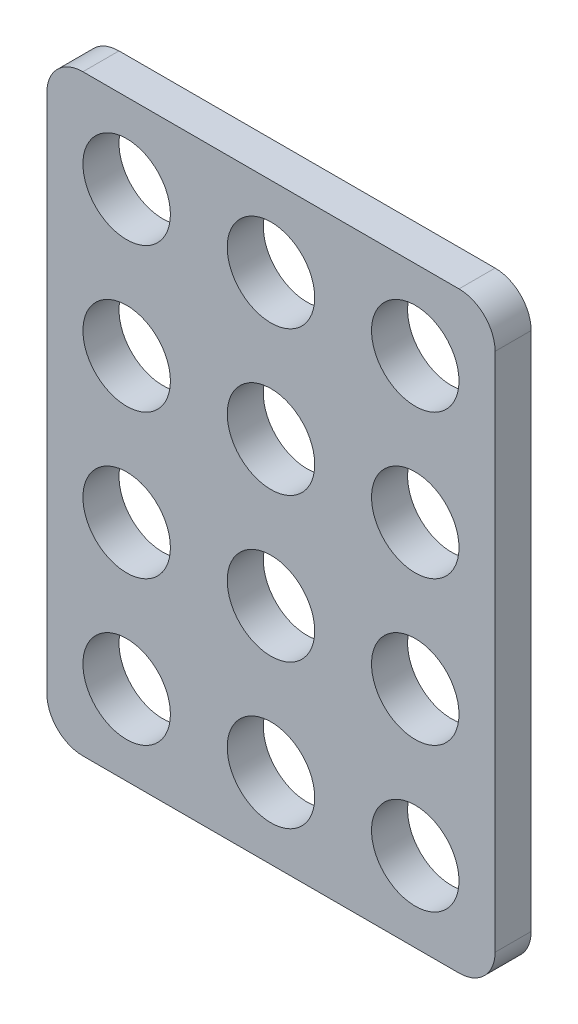
ISO-10303-21;
HEADER;
FILE_DESCRIPTION(('STEP AP214'),'2;1');
FILE_NAME('part.step','',(''),(''),'','','');
FILE_SCHEMA(('AUTOMOTIVE_DESIGN { 1 0 10303 214 1 1 1 1 }'));
ENDSEC;
DATA;
#1=APPLICATION_CONTEXT('core data for automotive mechanical design processes');
#2=APPLICATION_PROTOCOL_DEFINITION('international standard','automotive_design',2000,#1);
#3=PRODUCT_CONTEXT('',#1,'mechanical');
#4=PRODUCT('Part','Part','',(#3));
#5=PRODUCT_RELATED_PRODUCT_CATEGORY('part','',(#4));
#6=PRODUCT_DEFINITION_FORMATION('','',#4);
#7=PRODUCT_DEFINITION_CONTEXT('part definition',#1,'design');
#8=PRODUCT_DEFINITION('design','',#6,#7);
#9=PRODUCT_DEFINITION_SHAPE('','',#8);
#10=(LENGTH_UNIT() NAMED_UNIT(*) SI_UNIT(.MILLI.,.METRE.));
#11=(NAMED_UNIT(*) PLANE_ANGLE_UNIT() SI_UNIT($,.RADIAN.));
#12=(NAMED_UNIT(*) SI_UNIT($,.STERADIAN.) SOLID_ANGLE_UNIT());
#13=UNCERTAINTY_MEASURE_WITH_UNIT(LENGTH_MEASURE(1.E-05),#10,'distance_accuracy_value','');
#14=(GEOMETRIC_REPRESENTATION_CONTEXT(3) GLOBAL_UNCERTAINTY_ASSIGNED_CONTEXT((#13)) GLOBAL_UNIT_ASSIGNED_CONTEXT((#10,
#11,#12)) REPRESENTATION_CONTEXT('',''));
#15=CARTESIAN_POINT('',(0.,0.,0.));
#16=DIRECTION('',(0.,0.,1.));
#17=DIRECTION('',(1.,0.,0.));
#18=AXIS2_PLACEMENT_3D('',#15,#16,#17);
#19=CARTESIAN_POINT('',(22.85,2.,2.));
#20=DIRECTION('',(0.,0.,-1.));
#21=DIRECTION('',(-1.,0.,0.));
#22=AXIS2_PLACEMENT_3D('',#19,#20,#21);
#23=CYLINDRICAL_SURFACE('',#22,2.);
#24=CARTESIAN_POINT('',(22.85,2.,0.));
#25=DIRECTION('',(0.,0.,1.));
#26=DIRECTION('',(1.,0.,0.));
#27=AXIS2_PLACEMENT_3D('',#24,#25,#26);
#28=CIRCLE('',#27,2.);
#29=CARTESIAN_POINT('',(22.85,0.,0.));
#30=VERTEX_POINT('',#29);
#31=CARTESIAN_POINT('',(24.85,2.00000000000001,0.));
#32=VERTEX_POINT('',#31);
#33=EDGE_CURVE('E129',#30,#32,#28,.T.);
#34=ORIENTED_EDGE('',*,*,#33,.T.);
#35=DIRECTION('',(0.,0.,-1.));
#36=VECTOR('',#35,1.);
#37=CARTESIAN_POINT('',(24.85,2.00000000000001,2.));
#38=LINE('',#37,#36);
#39=CARTESIAN_POINT('',(24.85,2.00000000000001,2.));
#40=VERTEX_POINT('',#39);
#41=EDGE_CURVE('E11',#40,#32,#38,.T.);
#42=ORIENTED_EDGE('',*,*,#41,.F.);
#43=CARTESIAN_POINT('',(22.85,2.,2.));
#44=DIRECTION('',(0.,0.,1.));
#45=DIRECTION('',(1.,0.,0.));
#46=AXIS2_PLACEMENT_3D('',#43,#44,#45);
#47=CIRCLE('',#46,2.);
#48=CARTESIAN_POINT('',(22.85,0.,2.));
#49=VERTEX_POINT('',#48);
#50=EDGE_CURVE('E144',#49,#40,#47,.T.);
#51=ORIENTED_EDGE('',*,*,#50,.F.);
#52=DIRECTION('',(0.,0.,-1.));
#53=VECTOR('',#52,1.);
#54=CARTESIAN_POINT('',(22.85,0.,2.));
#55=LINE('',#54,#53);
#56=EDGE_CURVE('E125',#49,#30,#55,.T.);
#57=ORIENTED_EDGE('',*,*,#56,.T.);
#58=EDGE_LOOP('',(#34,#42,#51,#57));
#59=FACE_BOUND('',#58,.T.);
#60=ADVANCED_FACE('F33',(#59),#23,.T.);
#61=CARTESIAN_POINT('',(24.85,2.00000000000001,2.));
#62=DIRECTION('',(-1.,0.,0.));
#63=DIRECTION('',(0.,0.,1.));
#64=AXIS2_PLACEMENT_3D('',#61,#62,#63);
#65=PLANE('',#64);
#66=DIRECTION('',(0.,1.,0.));
#67=VECTOR('',#66,1.);
#68=CARTESIAN_POINT('',(24.85,2.00000000000001,0.));
#69=LINE('',#68,#67);
#70=CARTESIAN_POINT('',(24.85,30.85,0.));
#71=VERTEX_POINT('',#70);
#72=EDGE_CURVE('E132',#32,#71,#69,.T.);
#73=ORIENTED_EDGE('',*,*,#72,.T.);
#74=DIRECTION('',(0.,0.,-1.));
#75=VECTOR('',#74,1.);
#76=CARTESIAN_POINT('',(24.85,30.85,2.));
#77=LINE('',#76,#75);
#78=CARTESIAN_POINT('',(24.85,30.85,2.));
#79=VERTEX_POINT('',#78);
#80=EDGE_CURVE('E41',#79,#71,#77,.T.);
#81=ORIENTED_EDGE('',*,*,#80,.F.);
#82=DIRECTION('',(0.,1.,0.));
#83=VECTOR('',#82,1.);
#84=CARTESIAN_POINT('',(24.85,2.00000000000001,2.));
#85=LINE('',#84,#83);
#86=EDGE_CURVE('E92',#40,#79,#85,.T.);
#87=ORIENTED_EDGE('',*,*,#86,.F.);
#88=ORIENTED_EDGE('',*,*,#41,.T.);
#89=EDGE_LOOP('',(#73,#81,#87,#88));
#90=FACE_BOUND('',#89,.T.);
#91=ADVANCED_FACE('F286',(#90),#65,.F.);
#92=CARTESIAN_POINT('',(22.85,30.85,2.));
#93=DIRECTION('',(0.,0.,-1.));
#94=DIRECTION('',(-1.,0.,0.));
#95=AXIS2_PLACEMENT_3D('',#92,#93,#94);
#96=CYLINDRICAL_SURFACE('',#95,2.);
#97=CARTESIAN_POINT('',(22.85,30.85,0.));
#98=DIRECTION('',(0.,0.,1.));
#99=DIRECTION('',(-1.,0.,0.));
#100=AXIS2_PLACEMENT_3D('',#97,#98,#99);
#101=CIRCLE('',#100,2.);
#102=CARTESIAN_POINT('',(22.85,32.85,0.));
#103=VERTEX_POINT('',#102);
#104=EDGE_CURVE('E135',#71,#103,#101,.T.);
#105=ORIENTED_EDGE('',*,*,#104,.T.);
#106=DIRECTION('',(0.,0.,-1.));
#107=VECTOR('',#106,1.);
#108=CARTESIAN_POINT('',(22.85,32.85,2.));
#109=LINE('',#108,#107);
#110=CARTESIAN_POINT('',(22.85,32.85,2.));
#111=VERTEX_POINT('',#110);
#112=EDGE_CURVE('E151',#111,#103,#109,.T.);
#113=ORIENTED_EDGE('',*,*,#112,.F.);
#114=CARTESIAN_POINT('',(22.85,30.85,2.));
#115=DIRECTION('',(0.,0.,1.));
#116=DIRECTION('',(-1.,0.,0.));
#117=AXIS2_PLACEMENT_3D('',#114,#115,#116);
#118=CIRCLE('',#117,2.);
#119=EDGE_CURVE('E159',#79,#111,#118,.T.);
#120=ORIENTED_EDGE('',*,*,#119,.F.);
#121=ORIENTED_EDGE('',*,*,#80,.T.);
#122=EDGE_LOOP('',(#105,#113,#120,#121));
#123=FACE_BOUND('',#122,.T.);
#124=ADVANCED_FACE('F157',(#123),#96,.T.);
#125=CARTESIAN_POINT('',(2.00000000000001,32.85,2.));
#126=DIRECTION('',(0.,-1.,0.));
#127=DIRECTION('',(0.,0.,-1.));
#128=AXIS2_PLACEMENT_3D('',#125,#126,#127);
#129=PLANE('',#128);
#130=DIRECTION('',(-1.,0.,0.));
#131=VECTOR('',#130,1.);
#132=CARTESIAN_POINT('',(2.00000000000001,32.85,0.));
#133=LINE('',#132,#131);
#134=CARTESIAN_POINT('',(2.00000000000001,32.85,0.));
#135=VERTEX_POINT('',#134);
#136=EDGE_CURVE('E137',#103,#135,#133,.T.);
#137=ORIENTED_EDGE('',*,*,#136,.T.);
#138=DIRECTION('',(0.,0.,-1.));
#139=VECTOR('',#138,1.);
#140=CARTESIAN_POINT('',(2.00000000000001,32.85,2.));
#141=LINE('',#140,#139);
#142=CARTESIAN_POINT('',(2.00000000000001,32.85,2.));
#143=VERTEX_POINT('',#142);
#144=EDGE_CURVE('E148',#143,#135,#141,.T.);
#145=ORIENTED_EDGE('',*,*,#144,.F.);
#146=DIRECTION('',(-1.,0.,0.));
#147=VECTOR('',#146,1.);
#148=CARTESIAN_POINT('',(2.00000000000001,32.85,2.));
#149=LINE('',#148,#147);
#150=EDGE_CURVE('E171',#111,#143,#149,.T.);
#151=ORIENTED_EDGE('',*,*,#150,.F.);
#152=ORIENTED_EDGE('',*,*,#112,.T.);
#153=EDGE_LOOP('',(#137,#145,#151,#152));
#154=FACE_BOUND('',#153,.T.);
#155=ADVANCED_FACE('F167',(#154),#129,.F.);
#156=CARTESIAN_POINT('',(2.,30.85,2.));
#157=DIRECTION('',(0.,0.,-1.));
#158=DIRECTION('',(-1.,0.,0.));
#159=AXIS2_PLACEMENT_3D('',#156,#157,#158);
#160=CYLINDRICAL_SURFACE('',#159,2.);
#161=CARTESIAN_POINT('',(2.,30.85,0.));
#162=DIRECTION('',(0.,0.,1.));
#163=DIRECTION('',(-1.,0.,0.));
#164=AXIS2_PLACEMENT_3D('',#161,#162,#163);
#165=CIRCLE('',#164,2.);
#166=CARTESIAN_POINT('',(0.,30.85,0.));
#167=VERTEX_POINT('',#166);
#168=EDGE_CURVE('E139',#135,#167,#165,.T.);
#169=ORIENTED_EDGE('',*,*,#168,.T.);
#170=DIRECTION('',(0.,0.,-1.));
#171=VECTOR('',#170,1.);
#172=CARTESIAN_POINT('',(0.,30.85,2.));
#173=LINE('',#172,#171);
#174=CARTESIAN_POINT('',(0.,30.85,2.));
#175=VERTEX_POINT('',#174);
#176=EDGE_CURVE('E120',#175,#167,#173,.T.);
#177=ORIENTED_EDGE('',*,*,#176,.F.);
#178=CARTESIAN_POINT('',(2.,30.85,2.));
#179=DIRECTION('',(0.,0.,1.));
#180=DIRECTION('',(-1.,0.,0.));
#181=AXIS2_PLACEMENT_3D('',#178,#179,#180);
#182=CIRCLE('',#181,2.);
#183=EDGE_CURVE('E111',#143,#175,#182,.T.);
#184=ORIENTED_EDGE('',*,*,#183,.F.);
#185=ORIENTED_EDGE('',*,*,#144,.T.);
#186=EDGE_LOOP('',(#169,#177,#184,#185));
#187=FACE_BOUND('',#186,.T.);
#188=ADVANCED_FACE('F170',(#187),#160,.T.);
#189=CARTESIAN_POINT('',(0.,2.00000000000001,2.));
#190=DIRECTION('',(1.,0.,0.));
#191=DIRECTION('',(0.,0.,-1.));
#192=AXIS2_PLACEMENT_3D('',#189,#190,#191);
#193=PLANE('',#192);
#194=DIRECTION('',(0.,-1.,0.));
#195=VECTOR('',#194,1.);
#196=CARTESIAN_POINT('',(0.,2.00000000000001,0.));
#197=LINE('',#196,#195);
#198=CARTESIAN_POINT('',(0.,2.,0.));
#199=VERTEX_POINT('',#198);
#200=EDGE_CURVE('E119',#167,#199,#197,.T.);
#201=ORIENTED_EDGE('',*,*,#200,.T.);
#202=DIRECTION('',(0.,0.,-1.));
#203=VECTOR('',#202,1.);
#204=CARTESIAN_POINT('',(0.,2.,2.));
#205=LINE('',#204,#203);
#206=CARTESIAN_POINT('',(0.,2.,2.));
#207=VERTEX_POINT('',#206);
#208=EDGE_CURVE('E116',#207,#199,#205,.T.);
#209=ORIENTED_EDGE('',*,*,#208,.F.);
#210=DIRECTION('',(0.,-1.,0.));
#211=VECTOR('',#210,1.);
#212=CARTESIAN_POINT('',(0.,2.00000000000001,2.));
#213=LINE('',#212,#211);
#214=EDGE_CURVE('E105',#175,#207,#213,.T.);
#215=ORIENTED_EDGE('',*,*,#214,.F.);
#216=ORIENTED_EDGE('',*,*,#176,.T.);
#217=EDGE_LOOP('',(#201,#209,#215,#216));
#218=FACE_BOUND('',#217,.T.);
#219=ADVANCED_FACE('F117',(#218),#193,.F.);
#220=CARTESIAN_POINT('',(2.,2.,2.));
#221=DIRECTION('',(0.,0.,-1.));
#222=DIRECTION('',(-1.,0.,0.));
#223=AXIS2_PLACEMENT_3D('',#220,#221,#222);
#224=CYLINDRICAL_SURFACE('',#223,2.);
#225=CARTESIAN_POINT('',(2.,2.,0.));
#226=DIRECTION('',(0.,0.,1.));
#227=DIRECTION('',(-1.,0.,0.));
#228=AXIS2_PLACEMENT_3D('',#225,#226,#227);
#229=CIRCLE('',#228,2.);
#230=CARTESIAN_POINT('',(2.00000000000001,0.,0.));
#231=VERTEX_POINT('',#230);
#232=EDGE_CURVE('E78',#199,#231,#229,.T.);
#233=ORIENTED_EDGE('',*,*,#232,.T.);
#234=DIRECTION('',(0.,0.,-1.));
#235=VECTOR('',#234,1.);
#236=CARTESIAN_POINT('',(2.00000000000001,0.,2.));
#237=LINE('',#236,#235);
#238=CARTESIAN_POINT('',(2.00000000000001,0.,2.));
#239=VERTEX_POINT('',#238);
#240=EDGE_CURVE('E121',#239,#231,#237,.T.);
#241=ORIENTED_EDGE('',*,*,#240,.F.);
#242=CARTESIAN_POINT('',(2.,2.,2.));
#243=DIRECTION('',(0.,0.,1.));
#244=DIRECTION('',(-1.,0.,0.));
#245=AXIS2_PLACEMENT_3D('',#242,#243,#244);
#246=CIRCLE('',#245,2.);
#247=EDGE_CURVE('E109',#207,#239,#246,.T.);
#248=ORIENTED_EDGE('',*,*,#247,.F.);
#249=ORIENTED_EDGE('',*,*,#208,.T.);
#250=EDGE_LOOP('',(#233,#241,#248,#249));
#251=FACE_BOUND('',#250,.T.);
#252=ADVANCED_FACE('F123',(#251),#224,.T.);
#253=CARTESIAN_POINT('',(2.00000000000001,0.,2.));
#254=DIRECTION('',(0.,1.,0.));
#255=DIRECTION('',(0.,0.,1.));
#256=AXIS2_PLACEMENT_3D('',#253,#254,#255);
#257=PLANE('',#256);
#258=DIRECTION('',(1.,0.,0.));
#259=VECTOR('',#258,1.);
#260=CARTESIAN_POINT('',(2.00000000000001,0.,0.));
#261=LINE('',#260,#259);
#262=EDGE_CURVE('E84',#231,#30,#261,.T.);
#263=ORIENTED_EDGE('',*,*,#262,.T.);
#264=ORIENTED_EDGE('',*,*,#56,.F.);
#265=DIRECTION('',(1.,0.,0.));
#266=VECTOR('',#265,1.);
#267=CARTESIAN_POINT('',(2.00000000000001,0.,2.));
#268=LINE('',#267,#266);
#269=EDGE_CURVE('E49',#239,#49,#268,.T.);
#270=ORIENTED_EDGE('',*,*,#269,.F.);
#271=ORIENTED_EDGE('',*,*,#240,.T.);
#272=EDGE_LOOP('',(#263,#264,#270,#271));
#273=FACE_BOUND('',#272,.T.);
#274=ADVANCED_FACE('F261',(#273),#257,.F.);
#275=CARTESIAN_POINT('',(22.85,2.,2.));
#276=DIRECTION('',(0.,0.,1.));
#277=DIRECTION('',(1.,0.,0.));
#278=AXIS2_PLACEMENT_3D('',#275,#276,#277);
#279=PLANE('',#278);
#280=CARTESIAN_POINT('',(20.425,28.425,2.));
#281=DIRECTION('',(0.,0.,1.));
#282=DIRECTION('',(1.,0.,0.));
#283=AXIS2_PLACEMENT_3D('',#280,#281,#282);
#284=CIRCLE('',#283,2.425);
#285=CARTESIAN_POINT('',(22.85,28.425,2.));
#286=VERTEX_POINT('',#285);
#287=EDGE_CURVE('E183',#286,#286,#284,.T.);
#288=ORIENTED_EDGE('',*,*,#287,.F.);
#289=EDGE_LOOP('',(#288));
#290=FACE_BOUND('',#289,.T.);
#291=CARTESIAN_POINT('',(12.425,28.425,2.));
#292=DIRECTION('',(0.,0.,1.));
#293=DIRECTION('',(1.,0.,0.));
#294=AXIS2_PLACEMENT_3D('',#291,#292,#293);
#295=CIRCLE('',#294,2.425);
#296=CARTESIAN_POINT('',(14.85,28.425,2.));
#297=VERTEX_POINT('',#296);
#298=EDGE_CURVE('E189',#297,#297,#295,.T.);
#299=ORIENTED_EDGE('',*,*,#298,.F.);
#300=EDGE_LOOP('',(#299));
#301=FACE_BOUND('',#300,.T.);
#302=CARTESIAN_POINT('',(4.425,28.425,2.));
#303=DIRECTION('',(0.,0.,1.));
#304=DIRECTION('',(1.,0.,0.));
#305=AXIS2_PLACEMENT_3D('',#302,#303,#304);
#306=CIRCLE('',#305,2.425);
#307=CARTESIAN_POINT('',(6.85,28.425,2.));
#308=VERTEX_POINT('',#307);
#309=EDGE_CURVE('E195',#308,#308,#306,.T.);
#310=ORIENTED_EDGE('',*,*,#309,.F.);
#311=EDGE_LOOP('',(#310));
#312=FACE_BOUND('',#311,.T.);
#313=CARTESIAN_POINT('',(12.425,4.425,2.));
#314=DIRECTION('',(0.,0.,1.));
#315=DIRECTION('',(1.,0.,0.));
#316=AXIS2_PLACEMENT_3D('',#313,#314,#315);
#317=CIRCLE('',#316,2.425);
#318=CARTESIAN_POINT('',(14.85,4.425,2.));
#319=VERTEX_POINT('',#318);
#320=EDGE_CURVE('E221',#319,#319,#317,.T.);
#321=ORIENTED_EDGE('',*,*,#320,.F.);
#322=EDGE_LOOP('',(#321));
#323=FACE_BOUND('',#322,.T.);
#324=CARTESIAN_POINT('',(20.425,4.425,2.));
#325=DIRECTION('',(0.,0.,1.));
#326=DIRECTION('',(1.,0.,0.));
#327=AXIS2_PLACEMENT_3D('',#324,#325,#326);
#328=CIRCLE('',#327,2.425);
#329=CARTESIAN_POINT('',(22.85,4.425,2.));
#330=VERTEX_POINT('',#329);
#331=EDGE_CURVE('E215',#330,#330,#328,.T.);
#332=ORIENTED_EDGE('',*,*,#331,.F.);
#333=EDGE_LOOP('',(#332));
#334=FACE_BOUND('',#333,.T.);
#335=CARTESIAN_POINT('',(4.425,12.425,2.));
#336=DIRECTION('',(0.,0.,1.));
#337=DIRECTION('',(1.,0.,0.));
#338=AXIS2_PLACEMENT_3D('',#335,#336,#337);
#339=CIRCLE('',#338,2.425);
#340=CARTESIAN_POINT('',(6.85,12.425,2.));
#341=VERTEX_POINT('',#340);
#342=EDGE_CURVE('E209',#341,#341,#339,.T.);
#343=ORIENTED_EDGE('',*,*,#342,.F.);
#344=EDGE_LOOP('',(#343));
#345=FACE_BOUND('',#344,.T.);
#346=CARTESIAN_POINT('',(12.425,12.425,2.));
#347=DIRECTION('',(0.,0.,1.));
#348=DIRECTION('',(1.,0.,0.));
#349=AXIS2_PLACEMENT_3D('',#346,#347,#348);
#350=CIRCLE('',#349,2.425);
#351=CARTESIAN_POINT('',(14.85,12.425,2.));
#352=VERTEX_POINT('',#351);
#353=EDGE_CURVE('E202',#352,#352,#350,.T.);
#354=ORIENTED_EDGE('',*,*,#353,.F.);
#355=EDGE_LOOP('',(#354));
#356=FACE_BOUND('',#355,.T.);
#357=CARTESIAN_POINT('',(20.425,20.425,2.));
#358=DIRECTION('',(0.,0.,1.));
#359=DIRECTION('',(1.,0.,0.));
#360=AXIS2_PLACEMENT_3D('',#357,#358,#359);
#361=CIRCLE('',#360,2.425);
#362=CARTESIAN_POINT('',(22.85,20.425,2.));
#363=VERTEX_POINT('',#362);
#364=EDGE_CURVE('E201',#363,#363,#361,.T.);
#365=ORIENTED_EDGE('',*,*,#364,.F.);
#366=EDGE_LOOP('',(#365));
#367=FACE_BOUND('',#366,.T.);
#368=CARTESIAN_POINT('',(12.425,20.425,2.));
#369=DIRECTION('',(0.,0.,1.));
#370=DIRECTION('',(1.,0.,0.));
#371=AXIS2_PLACEMENT_3D('',#368,#369,#370);
#372=CIRCLE('',#371,2.425);
#373=CARTESIAN_POINT('',(14.85,20.425,2.));
#374=VERTEX_POINT('',#373);
#375=EDGE_CURVE('E243',#374,#374,#372,.T.);
#376=ORIENTED_EDGE('',*,*,#375,.F.);
#377=EDGE_LOOP('',(#376));
#378=FACE_BOUND('',#377,.T.);
#379=CARTESIAN_POINT('',(4.425,20.425,2.));
#380=DIRECTION('',(0.,0.,1.));
#381=DIRECTION('',(1.,0.,0.));
#382=AXIS2_PLACEMENT_3D('',#379,#380,#381);
#383=CIRCLE('',#382,2.425);
#384=CARTESIAN_POINT('',(6.85,20.425,2.));
#385=VERTEX_POINT('',#384);
#386=EDGE_CURVE('E226',#385,#385,#383,.T.);
#387=ORIENTED_EDGE('',*,*,#386,.F.);
#388=EDGE_LOOP('',(#387));
#389=FACE_BOUND('',#388,.T.);
#390=CARTESIAN_POINT('',(20.425,12.425,2.));
#391=DIRECTION('',(0.,0.,1.));
#392=DIRECTION('',(1.,0.,0.));
#393=AXIS2_PLACEMENT_3D('',#390,#391,#392);
#394=CIRCLE('',#393,2.425);
#395=CARTESIAN_POINT('',(22.85,12.425,2.));
#396=VERTEX_POINT('',#395);
#397=EDGE_CURVE('E233',#396,#396,#394,.T.);
#398=ORIENTED_EDGE('',*,*,#397,.F.);
#399=EDGE_LOOP('',(#398));
#400=FACE_BOUND('',#399,.T.);
#401=CARTESIAN_POINT('',(4.425,4.425,2.));
#402=DIRECTION('',(0.,0.,1.));
#403=DIRECTION('',(1.,0.,0.));
#404=AXIS2_PLACEMENT_3D('',#401,#402,#403);
#405=CIRCLE('',#404,2.425);
#406=CARTESIAN_POINT('',(6.85,4.425,2.));
#407=VERTEX_POINT('',#406);
#408=EDGE_CURVE('E177',#407,#407,#405,.T.);
#409=ORIENTED_EDGE('',*,*,#408,.F.);
#410=EDGE_LOOP('',(#409));
#411=FACE_BOUND('',#410,.T.);
#412=ORIENTED_EDGE('',*,*,#50,.T.);
#413=ORIENTED_EDGE('',*,*,#86,.T.);
#414=ORIENTED_EDGE('',*,*,#119,.T.);
#415=ORIENTED_EDGE('',*,*,#150,.T.);
#416=ORIENTED_EDGE('',*,*,#183,.T.);
#417=ORIENTED_EDGE('',*,*,#214,.T.);
#418=ORIENTED_EDGE('',*,*,#247,.T.);
#419=ORIENTED_EDGE('',*,*,#269,.T.);
#420=EDGE_LOOP('',(#412,#413,#414,#415,#416,#417,#418,#419));
#421=FACE_BOUND('',#420,.T.);
#422=ADVANCED_FACE('F107',(#290,#301,#312,#323,#334,#345,#356,#367,#378,#389,#400,#411,#421),
#279,.T.);
#423=CARTESIAN_POINT('',(22.85,2.,0.));
#424=DIRECTION('',(0.,0.,1.));
#425=DIRECTION('',(1.,0.,0.));
#426=AXIS2_PLACEMENT_3D('',#423,#424,#425);
#427=PLANE('',#426);
#428=CARTESIAN_POINT('',(20.425,28.425,0.));
#429=DIRECTION('',(0.,0.,1.));
#430=DIRECTION('',(1.,0.,0.));
#431=AXIS2_PLACEMENT_3D('',#428,#429,#430);
#432=CIRCLE('',#431,2.425);
#433=CARTESIAN_POINT('',(22.85,28.425,0.));
#434=VERTEX_POINT('',#433);
#435=EDGE_CURVE('E186',#434,#434,#432,.T.);
#436=ORIENTED_EDGE('',*,*,#435,.T.);
#437=EDGE_LOOP('',(#436));
#438=FACE_BOUND('',#437,.T.);
#439=CARTESIAN_POINT('',(12.425,28.425,0.));
#440=DIRECTION('',(0.,0.,1.));
#441=DIRECTION('',(1.,0.,0.));
#442=AXIS2_PLACEMENT_3D('',#439,#440,#441);
#443=CIRCLE('',#442,2.425);
#444=CARTESIAN_POINT('',(14.85,28.425,0.));
#445=VERTEX_POINT('',#444);
#446=EDGE_CURVE('E192',#445,#445,#443,.T.);
#447=ORIENTED_EDGE('',*,*,#446,.T.);
#448=EDGE_LOOP('',(#447));
#449=FACE_BOUND('',#448,.T.);
#450=CARTESIAN_POINT('',(4.425,28.425,0.));
#451=DIRECTION('',(0.,0.,1.));
#452=DIRECTION('',(1.,0.,0.));
#453=AXIS2_PLACEMENT_3D('',#450,#451,#452);
#454=CIRCLE('',#453,2.425);
#455=CARTESIAN_POINT('',(6.85,28.425,0.));
#456=VERTEX_POINT('',#455);
#457=EDGE_CURVE('E198',#456,#456,#454,.T.);
#458=ORIENTED_EDGE('',*,*,#457,.T.);
#459=EDGE_LOOP('',(#458));
#460=FACE_BOUND('',#459,.T.);
#461=CARTESIAN_POINT('',(12.425,4.425,0.));
#462=DIRECTION('',(0.,0.,1.));
#463=DIRECTION('',(1.,0.,0.));
#464=AXIS2_PLACEMENT_3D('',#461,#462,#463);
#465=CIRCLE('',#464,2.425);
#466=CARTESIAN_POINT('',(14.85,4.425,0.));
#467=VERTEX_POINT('',#466);
#468=EDGE_CURVE('E180',#467,#467,#465,.T.);
#469=ORIENTED_EDGE('',*,*,#468,.T.);
#470=EDGE_LOOP('',(#469));
#471=FACE_BOUND('',#470,.T.);
#472=CARTESIAN_POINT('',(20.425,4.425,0.));
#473=DIRECTION('',(0.,0.,1.));
#474=DIRECTION('',(1.,0.,0.));
#475=AXIS2_PLACEMENT_3D('',#472,#473,#474);
#476=CIRCLE('',#475,2.425);
#477=CARTESIAN_POINT('',(22.85,4.425,0.));
#478=VERTEX_POINT('',#477);
#479=EDGE_CURVE('E218',#478,#478,#476,.T.);
#480=ORIENTED_EDGE('',*,*,#479,.T.);
#481=EDGE_LOOP('',(#480));
#482=FACE_BOUND('',#481,.T.);
#483=CARTESIAN_POINT('',(4.425,12.425,0.));
#484=DIRECTION('',(0.,0.,1.));
#485=DIRECTION('',(1.,0.,0.));
#486=AXIS2_PLACEMENT_3D('',#483,#484,#485);
#487=CIRCLE('',#486,2.425);
#488=CARTESIAN_POINT('',(6.85,12.425,0.));
#489=VERTEX_POINT('',#488);
#490=EDGE_CURVE('E212',#489,#489,#487,.T.);
#491=ORIENTED_EDGE('',*,*,#490,.T.);
#492=EDGE_LOOP('',(#491));
#493=FACE_BOUND('',#492,.T.);
#494=CARTESIAN_POINT('',(12.425,12.425,0.));
#495=DIRECTION('',(0.,0.,1.));
#496=DIRECTION('',(1.,0.,0.));
#497=AXIS2_PLACEMENT_3D('',#494,#495,#496);
#498=CIRCLE('',#497,2.425);
#499=CARTESIAN_POINT('',(14.85,12.425,0.));
#500=VERTEX_POINT('',#499);
#501=EDGE_CURVE('E205',#500,#500,#498,.T.);
#502=ORIENTED_EDGE('',*,*,#501,.T.);
#503=EDGE_LOOP('',(#502));
#504=FACE_BOUND('',#503,.T.);
#505=CARTESIAN_POINT('',(20.425,20.425,0.));
#506=DIRECTION('',(0.,0.,1.));
#507=DIRECTION('',(1.,0.,0.));
#508=AXIS2_PLACEMENT_3D('',#505,#506,#507);
#509=CIRCLE('',#508,2.425);
#510=CARTESIAN_POINT('',(22.85,20.425,0.));
#511=VERTEX_POINT('',#510);
#512=EDGE_CURVE('E240',#511,#511,#509,.T.);
#513=ORIENTED_EDGE('',*,*,#512,.T.);
#514=EDGE_LOOP('',(#513));
#515=FACE_BOUND('',#514,.T.);
#516=CARTESIAN_POINT('',(12.425,20.425,0.));
#517=DIRECTION('',(0.,0.,1.));
#518=DIRECTION('',(1.,0.,0.));
#519=AXIS2_PLACEMENT_3D('',#516,#517,#518);
#520=CIRCLE('',#519,2.425);
#521=CARTESIAN_POINT('',(14.85,20.425,0.));
#522=VERTEX_POINT('',#521);
#523=EDGE_CURVE('E230',#522,#522,#520,.T.);
#524=ORIENTED_EDGE('',*,*,#523,.T.);
#525=EDGE_LOOP('',(#524));
#526=FACE_BOUND('',#525,.T.);
#527=CARTESIAN_POINT('',(4.425,20.425,0.));
#528=DIRECTION('',(0.,0.,1.));
#529=DIRECTION('',(1.,0.,0.));
#530=AXIS2_PLACEMENT_3D('',#527,#528,#529);
#531=CIRCLE('',#530,2.425);
#532=CARTESIAN_POINT('',(6.85,20.425,0.));
#533=VERTEX_POINT('',#532);
#534=EDGE_CURVE('E229',#533,#533,#531,.T.);
#535=ORIENTED_EDGE('',*,*,#534,.T.);
#536=EDGE_LOOP('',(#535));
#537=FACE_BOUND('',#536,.T.);
#538=CARTESIAN_POINT('',(20.425,12.425,0.));
#539=DIRECTION('',(0.,0.,1.));
#540=DIRECTION('',(1.,0.,0.));
#541=AXIS2_PLACEMENT_3D('',#538,#539,#540);
#542=CIRCLE('',#541,2.425);
#543=CARTESIAN_POINT('',(22.85,12.425,0.));
#544=VERTEX_POINT('',#543);
#545=EDGE_CURVE('E206',#544,#544,#542,.T.);
#546=ORIENTED_EDGE('',*,*,#545,.T.);
#547=EDGE_LOOP('',(#546));
#548=FACE_BOUND('',#547,.T.);
#549=CARTESIAN_POINT('',(4.425,4.425,0.));
#550=DIRECTION('',(0.,0.,1.));
#551=DIRECTION('',(1.,0.,0.));
#552=AXIS2_PLACEMENT_3D('',#549,#550,#551);
#553=CIRCLE('',#552,2.425);
#554=CARTESIAN_POINT('',(6.85,4.425,0.));
#555=VERTEX_POINT('',#554);
#556=EDGE_CURVE('E133',#555,#555,#553,.T.);
#557=ORIENTED_EDGE('',*,*,#556,.T.);
#558=EDGE_LOOP('',(#557));
#559=FACE_BOUND('',#558,.T.);
#560=ORIENTED_EDGE('',*,*,#33,.F.);
#561=ORIENTED_EDGE('',*,*,#262,.F.);
#562=ORIENTED_EDGE('',*,*,#232,.F.);
#563=ORIENTED_EDGE('',*,*,#200,.F.);
#564=ORIENTED_EDGE('',*,*,#168,.F.);
#565=ORIENTED_EDGE('',*,*,#136,.F.);
#566=ORIENTED_EDGE('',*,*,#104,.F.);
#567=ORIENTED_EDGE('',*,*,#72,.F.);
#568=EDGE_LOOP('',(#560,#561,#562,#563,#564,#565,#566,#567));
#569=FACE_BOUND('',#568,.T.);
#570=ADVANCED_FACE('F163',(#438,#449,#460,#471,#482,#493,#504,#515,#526,#537,#548,#559,#569),
#427,.F.);
#571=CARTESIAN_POINT('',(4.425,4.425,0.));
#572=DIRECTION('',(0.,0.,1.));
#573=DIRECTION('',(1.,0.,0.));
#574=AXIS2_PLACEMENT_3D('',#571,#572,#573);
#575=CYLINDRICAL_SURFACE('',#574,2.425);
#576=ORIENTED_EDGE('',*,*,#556,.F.);
#577=EDGE_LOOP('',(#576));
#578=FACE_BOUND('',#577,.T.);
#579=ORIENTED_EDGE('',*,*,#408,.T.);
#580=EDGE_LOOP('',(#579));
#581=FACE_BOUND('',#580,.T.);
#582=ADVANCED_FACE('F270',(#578,#581),#575,.F.);
#583=CARTESIAN_POINT('',(20.425,12.425,0.));
#584=DIRECTION('',(0.,0.,1.));
#585=DIRECTION('',(1.,0.,0.));
#586=AXIS2_PLACEMENT_3D('',#583,#584,#585);
#587=CYLINDRICAL_SURFACE('',#586,2.425);
#588=ORIENTED_EDGE('',*,*,#545,.F.);
#589=EDGE_LOOP('',(#588));
#590=FACE_BOUND('',#589,.T.);
#591=ORIENTED_EDGE('',*,*,#397,.T.);
#592=EDGE_LOOP('',(#591));
#593=FACE_BOUND('',#592,.T.);
#594=ADVANCED_FACE('F272',(#590,#593),#587,.F.);
#595=CARTESIAN_POINT('',(4.425,20.425,0.));
#596=DIRECTION('',(0.,0.,1.));
#597=DIRECTION('',(1.,0.,0.));
#598=AXIS2_PLACEMENT_3D('',#595,#596,#597);
#599=CYLINDRICAL_SURFACE('',#598,2.425);
#600=ORIENTED_EDGE('',*,*,#534,.F.);
#601=EDGE_LOOP('',(#600));
#602=FACE_BOUND('',#601,.T.);
#603=ORIENTED_EDGE('',*,*,#386,.T.);
#604=EDGE_LOOP('',(#603));
#605=FACE_BOUND('',#604,.T.);
#606=ADVANCED_FACE('F255',(#602,#605),#599,.F.);
#607=CARTESIAN_POINT('',(12.425,20.425,0.));
#608=DIRECTION('',(0.,0.,1.));
#609=DIRECTION('',(1.,0.,0.));
#610=AXIS2_PLACEMENT_3D('',#607,#608,#609);
#611=CYLINDRICAL_SURFACE('',#610,2.425);
#612=ORIENTED_EDGE('',*,*,#523,.F.);
#613=EDGE_LOOP('',(#612));
#614=FACE_BOUND('',#613,.T.);
#615=ORIENTED_EDGE('',*,*,#375,.T.);
#616=EDGE_LOOP('',(#615));
#617=FACE_BOUND('',#616,.T.);
#618=ADVANCED_FACE('F251',(#614,#617),#611,.F.);
#619=CARTESIAN_POINT('',(20.425,20.425,0.));
#620=DIRECTION('',(0.,0.,1.));
#621=DIRECTION('',(1.,0.,0.));
#622=AXIS2_PLACEMENT_3D('',#619,#620,#621);
#623=CYLINDRICAL_SURFACE('',#622,2.425);
#624=ORIENTED_EDGE('',*,*,#512,.F.);
#625=EDGE_LOOP('',(#624));
#626=FACE_BOUND('',#625,.T.);
#627=ORIENTED_EDGE('',*,*,#364,.T.);
#628=EDGE_LOOP('',(#627));
#629=FACE_BOUND('',#628,.T.);
#630=ADVANCED_FACE('F254',(#626,#629),#623,.F.);
#631=CARTESIAN_POINT('',(12.425,12.425,0.));
#632=DIRECTION('',(0.,0.,1.));
#633=DIRECTION('',(1.,0.,0.));
#634=AXIS2_PLACEMENT_3D('',#631,#632,#633);
#635=CYLINDRICAL_SURFACE('',#634,2.425);
#636=ORIENTED_EDGE('',*,*,#501,.F.);
#637=EDGE_LOOP('',(#636));
#638=FACE_BOUND('',#637,.T.);
#639=ORIENTED_EDGE('',*,*,#353,.T.);
#640=EDGE_LOOP('',(#639));
#641=FACE_BOUND('',#640,.T.);
#642=ADVANCED_FACE('F377',(#638,#641),#635,.F.);
#643=CARTESIAN_POINT('',(4.425,12.425,0.));
#644=DIRECTION('',(0.,0.,1.));
#645=DIRECTION('',(1.,0.,0.));
#646=AXIS2_PLACEMENT_3D('',#643,#644,#645);
#647=CYLINDRICAL_SURFACE('',#646,2.425);
#648=ORIENTED_EDGE('',*,*,#490,.F.);
#649=EDGE_LOOP('',(#648));
#650=FACE_BOUND('',#649,.T.);
#651=ORIENTED_EDGE('',*,*,#342,.T.);
#652=EDGE_LOOP('',(#651));
#653=FACE_BOUND('',#652,.T.);
#654=ADVANCED_FACE('F387',(#650,#653),#647,.F.);
#655=CARTESIAN_POINT('',(20.425,4.425,0.));
#656=DIRECTION('',(0.,0.,1.));
#657=DIRECTION('',(1.,0.,0.));
#658=AXIS2_PLACEMENT_3D('',#655,#656,#657);
#659=CYLINDRICAL_SURFACE('',#658,2.425);
#660=ORIENTED_EDGE('',*,*,#479,.F.);
#661=EDGE_LOOP('',(#660));
#662=FACE_BOUND('',#661,.T.);
#663=ORIENTED_EDGE('',*,*,#331,.T.);
#664=EDGE_LOOP('',(#663));
#665=FACE_BOUND('',#664,.T.);
#666=ADVANCED_FACE('F397',(#662,#665),#659,.F.);
#667=CARTESIAN_POINT('',(12.425,4.425,0.));
#668=DIRECTION('',(0.,0.,1.));
#669=DIRECTION('',(1.,0.,0.));
#670=AXIS2_PLACEMENT_3D('',#667,#668,#669);
#671=CYLINDRICAL_SURFACE('',#670,2.425);
#672=ORIENTED_EDGE('',*,*,#468,.F.);
#673=EDGE_LOOP('',(#672));
#674=FACE_BOUND('',#673,.T.);
#675=ORIENTED_EDGE('',*,*,#320,.T.);
#676=EDGE_LOOP('',(#675));
#677=FACE_BOUND('',#676,.T.);
#678=ADVANCED_FACE('F407',(#674,#677),#671,.F.);
#679=CARTESIAN_POINT('',(4.425,28.425,0.));
#680=DIRECTION('',(0.,0.,1.));
#681=DIRECTION('',(1.,0.,0.));
#682=AXIS2_PLACEMENT_3D('',#679,#680,#681);
#683=CYLINDRICAL_SURFACE('',#682,2.425);
#684=ORIENTED_EDGE('',*,*,#457,.F.);
#685=EDGE_LOOP('',(#684));
#686=FACE_BOUND('',#685,.T.);
#687=ORIENTED_EDGE('',*,*,#309,.T.);
#688=EDGE_LOOP('',(#687));
#689=FACE_BOUND('',#688,.T.);
#690=ADVANCED_FACE('F417',(#686,#689),#683,.F.);
#691=CARTESIAN_POINT('',(12.425,28.425,0.));
#692=DIRECTION('',(0.,0.,1.));
#693=DIRECTION('',(1.,0.,0.));
#694=AXIS2_PLACEMENT_3D('',#691,#692,#693);
#695=CYLINDRICAL_SURFACE('',#694,2.425);
#696=ORIENTED_EDGE('',*,*,#446,.F.);
#697=EDGE_LOOP('',(#696));
#698=FACE_BOUND('',#697,.T.);
#699=ORIENTED_EDGE('',*,*,#298,.T.);
#700=EDGE_LOOP('',(#699));
#701=FACE_BOUND('',#700,.T.);
#702=ADVANCED_FACE('F427',(#698,#701),#695,.F.);
#703=CARTESIAN_POINT('',(20.425,28.425,0.));
#704=DIRECTION('',(0.,0.,1.));
#705=DIRECTION('',(1.,0.,0.));
#706=AXIS2_PLACEMENT_3D('',#703,#704,#705);
#707=CYLINDRICAL_SURFACE('',#706,2.425);
#708=ORIENTED_EDGE('',*,*,#435,.F.);
#709=EDGE_LOOP('',(#708));
#710=FACE_BOUND('',#709,.T.);
#711=ORIENTED_EDGE('',*,*,#287,.T.);
#712=EDGE_LOOP('',(#711));
#713=FACE_BOUND('',#712,.T.);
#714=ADVANCED_FACE('F437',(#710,#713),#707,.F.);
#715=CLOSED_SHELL('',(#60,#91,#124,#155,#188,#219,#252,#274,#422,#570,#582,#594,#606,#618,#630,
#642,#654,#666,#678,#690,#702,#714));
#716=MANIFOLD_SOLID_BREP('B2',#715);
#717=ADVANCED_BREP_SHAPE_REPRESENTATION('',(#18,#716),#14);
#718=SHAPE_DEFINITION_REPRESENTATION(#9,#717);
ENDSEC;
END-ISO-10303-21;
